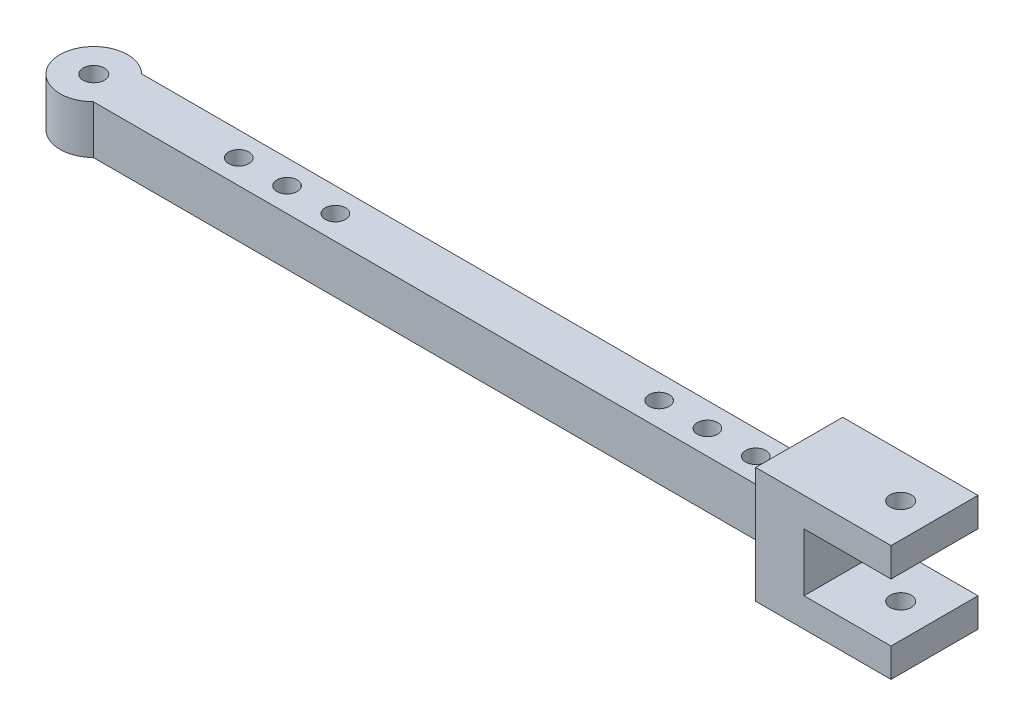
ISO-10303-21;
HEADER;
FILE_DESCRIPTION(('STEP AP214'),'2;1');
FILE_NAME('part.step','',(''),(''),'','','');
FILE_SCHEMA(('AUTOMOTIVE_DESIGN { 1 0 10303 214 1 1 1 1 }'));
ENDSEC;
DATA;
#1=APPLICATION_CONTEXT('core data for automotive mechanical design processes');
#2=APPLICATION_PROTOCOL_DEFINITION('international standard','automotive_design',2000,#1);
#3=PRODUCT_CONTEXT('',#1,'mechanical');
#4=PRODUCT('Part','Part','',(#3));
#5=PRODUCT_RELATED_PRODUCT_CATEGORY('part','',(#4));
#6=PRODUCT_DEFINITION_FORMATION('','',#4);
#7=PRODUCT_DEFINITION_CONTEXT('part definition',#1,'design');
#8=PRODUCT_DEFINITION('design','',#6,#7);
#9=PRODUCT_DEFINITION_SHAPE('','',#8);
#10=(LENGTH_UNIT() NAMED_UNIT(*) SI_UNIT(.MILLI.,.METRE.));
#11=(NAMED_UNIT(*) PLANE_ANGLE_UNIT() SI_UNIT($,.RADIAN.));
#12=(NAMED_UNIT(*) SI_UNIT($,.STERADIAN.) SOLID_ANGLE_UNIT());
#13=UNCERTAINTY_MEASURE_WITH_UNIT(LENGTH_MEASURE(1.E-05),#10,'distance_accuracy_value','');
#14=(GEOMETRIC_REPRESENTATION_CONTEXT(3) GLOBAL_UNCERTAINTY_ASSIGNED_CONTEXT((#13)) GLOBAL_UNIT_ASSIGNED_CONTEXT((#10,
#11,#12)) REPRESENTATION_CONTEXT('',''));
#15=CARTESIAN_POINT('',(0.,0.,0.));
#16=DIRECTION('',(0.,0.,1.));
#17=DIRECTION('',(1.,0.,0.));
#18=AXIS2_PLACEMENT_3D('',#15,#16,#17);
#19=CARTESIAN_POINT('',(47.,-3.5,-4.5));
#20=DIRECTION('',(1.,0.,0.));
#21=DIRECTION('',(0.,0.,-1.));
#22=AXIS2_PLACEMENT_3D('',#19,#20,#21);
#23=PLANE('',#22);
#24=DIRECTION('',(0.,1.,0.));
#25=VECTOR('',#24,1.);
#26=CARTESIAN_POINT('',(47.,-3.5,4.5));
#27=LINE('',#26,#25);
#28=CARTESIAN_POINT('',(47.,5.5,4.5));
#29=VERTEX_POINT('',#28);
#30=CARTESIAN_POINT('',(47.,8.5,4.5));
#31=VERTEX_POINT('',#30);
#32=EDGE_CURVE('E167',#29,#31,#27,.T.);
#33=ORIENTED_EDGE('',*,*,#32,.F.);
#34=DIRECTION('',(0.,0.,-1.));
#35=VECTOR('',#34,1.);
#36=CARTESIAN_POINT('',(47.,5.5,-4.5));
#37=LINE('',#36,#35);
#38=CARTESIAN_POINT('',(47.,5.5,-4.5));
#39=VERTEX_POINT('',#38);
#40=EDGE_CURVE('E208',#29,#39,#37,.T.);
#41=ORIENTED_EDGE('',*,*,#40,.T.);
#42=DIRECTION('',(0.,1.,0.));
#43=VECTOR('',#42,1.);
#44=CARTESIAN_POINT('',(47.,-3.5,-4.5));
#45=LINE('',#44,#43);
#46=CARTESIAN_POINT('',(47.,8.5,-4.5));
#47=VERTEX_POINT('',#46);
#48=EDGE_CURVE('E163',#39,#47,#45,.T.);
#49=ORIENTED_EDGE('',*,*,#48,.T.);
#50=DIRECTION('',(0.,0.,-1.));
#51=VECTOR('',#50,1.);
#52=CARTESIAN_POINT('',(47.,8.5,-4.5));
#53=LINE('',#52,#51);
#54=EDGE_CURVE('E180',#31,#47,#53,.T.);
#55=ORIENTED_EDGE('',*,*,#54,.F.);
#56=EDGE_LOOP('',(#33,#41,#49,#55));
#57=FACE_BOUND('',#56,.T.);
#58=ADVANCED_FACE('F35',(#57),#23,.T.);
#59=DIRECTION('',(0.,0.,-1.));
#60=VECTOR('',#59,1.);
#61=CARTESIAN_POINT('',(47.,-0.5,-4.5));
#62=LINE('',#61,#60);
#63=CARTESIAN_POINT('',(47.,-0.5,4.5));
#64=VERTEX_POINT('',#63);
#65=CARTESIAN_POINT('',(47.,-0.5,-4.5));
#66=VERTEX_POINT('',#65);
#67=EDGE_CURVE('E203',#64,#66,#62,.T.);
#68=ORIENTED_EDGE('',*,*,#67,.F.);
#69=CARTESIAN_POINT('',(47.,-3.5,4.5));
#70=VERTEX_POINT('',#69);
#71=EDGE_CURVE('E158',#70,#64,#27,.T.);
#72=ORIENTED_EDGE('',*,*,#71,.F.);
#73=DIRECTION('',(0.,0.,-1.));
#74=VECTOR('',#73,1.);
#75=CARTESIAN_POINT('',(47.,-3.5,-4.5));
#76=LINE('',#75,#74);
#77=CARTESIAN_POINT('',(47.,-3.5,-4.5));
#78=VERTEX_POINT('',#77);
#79=EDGE_CURVE('E173',#70,#78,#76,.T.);
#80=ORIENTED_EDGE('',*,*,#79,.T.);
#81=EDGE_CURVE('E159',#78,#66,#45,.T.);
#82=ORIENTED_EDGE('',*,*,#81,.T.);
#83=EDGE_LOOP('',(#68,#72,#80,#82));
#84=FACE_BOUND('',#83,.T.);
#85=ADVANCED_FACE('F335',(#84),#23,.T.);
#86=CARTESIAN_POINT('',(33.,-3.5,4.5));
#87=DIRECTION('',(0.,0.,1.));
#88=DIRECTION('',(1.,0.,0.));
#89=AXIS2_PLACEMENT_3D('',#86,#87,#88);
#90=PLANE('',#89);
#91=DIRECTION('',(1.,0.,0.));
#92=VECTOR('',#91,1.);
#93=CARTESIAN_POINT('',(47.,-0.5,4.5));
#94=LINE('',#93,#92);
#95=CARTESIAN_POINT('',(38.,-0.5,4.5));
#96=VERTEX_POINT('',#95);
#97=EDGE_CURVE('E197',#96,#64,#94,.T.);
#98=ORIENTED_EDGE('',*,*,#97,.F.);
#99=DIRECTION('',(0.,1.,0.));
#100=VECTOR('',#99,1.);
#101=CARTESIAN_POINT('',(38.,-0.5,4.5));
#102=LINE('',#101,#100);
#103=CARTESIAN_POINT('',(38.,5.5,4.5));
#104=VERTEX_POINT('',#103);
#105=EDGE_CURVE('E183',#96,#104,#102,.T.);
#106=ORIENTED_EDGE('',*,*,#105,.T.);
#107=DIRECTION('',(1.,0.,0.));
#108=VECTOR('',#107,1.);
#109=CARTESIAN_POINT('',(47.,5.5,4.5));
#110=LINE('',#109,#108);
#111=EDGE_CURVE('E200',#104,#29,#110,.T.);
#112=ORIENTED_EDGE('',*,*,#111,.T.);
#113=ORIENTED_EDGE('',*,*,#32,.T.);
#114=DIRECTION('',(1.,0.,0.));
#115=VECTOR('',#114,1.);
#116=CARTESIAN_POINT('',(33.,8.5,4.5));
#117=LINE('',#116,#115);
#118=CARTESIAN_POINT('',(33.,8.5,4.5));
#119=VERTEX_POINT('',#118);
#120=EDGE_CURVE('E170',#119,#31,#117,.T.);
#121=ORIENTED_EDGE('',*,*,#120,.F.);
#122=DIRECTION('',(0.,1.,0.));
#123=VECTOR('',#122,1.);
#124=CARTESIAN_POINT('',(33.,-3.5,4.5));
#125=LINE('',#124,#123);
#126=CARTESIAN_POINT('',(33.,-3.5,4.5));
#127=VERTEX_POINT('',#126);
#128=EDGE_CURVE('E165',#127,#119,#125,.T.);
#129=ORIENTED_EDGE('',*,*,#128,.F.);
#130=DIRECTION('',(1.,0.,0.));
#131=VECTOR('',#130,1.);
#132=CARTESIAN_POINT('',(33.,-3.5,4.5));
#133=LINE('',#132,#131);
#134=EDGE_CURVE('E184',#127,#70,#133,.T.);
#135=ORIENTED_EDGE('',*,*,#134,.T.);
#136=ORIENTED_EDGE('',*,*,#71,.T.);
#137=EDGE_LOOP('',(#98,#106,#112,#113,#121,#129,#135,#136));
#138=FACE_BOUND('',#137,.T.);
#139=ADVANCED_FACE('F316',(#138),#90,.T.);
#140=CARTESIAN_POINT('',(33.,-3.5,-4.5));
#141=DIRECTION('',(-1.,0.,0.));
#142=DIRECTION('',(0.,0.,1.));
#143=AXIS2_PLACEMENT_3D('',#140,#141,#142);
#144=PLANE('',#143);
#145=DIRECTION('',(0.,-1.,0.));
#146=VECTOR('',#145,1.);
#147=CARTESIAN_POINT('',(33.,5.,-2.5));
#148=LINE('',#147,#146);
#149=CARTESIAN_POINT('',(33.,5.,-2.5));
#150=VERTEX_POINT('',#149);
#151=CARTESIAN_POINT('',(33.,0.,-2.5));
#152=VERTEX_POINT('',#151);
#153=EDGE_CURVE('E153',#150,#152,#148,.T.);
#154=ORIENTED_EDGE('',*,*,#153,.F.);
#155=DIRECTION('',(0.,0.,1.));
#156=VECTOR('',#155,1.);
#157=CARTESIAN_POINT('',(33.,5.,0.));
#158=LINE('',#157,#156);
#159=CARTESIAN_POINT('',(33.,5.,2.5));
#160=VERTEX_POINT('',#159);
#161=EDGE_CURVE('E147',#150,#160,#158,.T.);
#162=ORIENTED_EDGE('',*,*,#161,.T.);
#163=DIRECTION('',(0.,1.,0.));
#164=VECTOR('',#163,1.);
#165=CARTESIAN_POINT('',(33.,5.,2.5));
#166=LINE('',#165,#164);
#167=CARTESIAN_POINT('',(33.,0.,2.5));
#168=VERTEX_POINT('',#167);
#169=EDGE_CURVE('E156',#168,#160,#166,.T.);
#170=ORIENTED_EDGE('',*,*,#169,.F.);
#171=DIRECTION('',(0.,0.,1.));
#172=VECTOR('',#171,1.);
#173=CARTESIAN_POINT('',(33.,0.,0.));
#174=LINE('',#173,#172);
#175=EDGE_CURVE('E11',#152,#168,#174,.T.);
#176=ORIENTED_EDGE('',*,*,#175,.F.);
#177=EDGE_LOOP('',(#154,#162,#170,#176));
#178=FACE_BOUND('',#177,.T.);
#179=DIRECTION('',(0.,0.,1.));
#180=VECTOR('',#179,1.);
#181=CARTESIAN_POINT('',(33.,8.5,-4.5));
#182=LINE('',#181,#180);
#183=CARTESIAN_POINT('',(33.,8.5,-4.5));
#184=VERTEX_POINT('',#183);
#185=EDGE_CURVE('E174',#184,#119,#182,.T.);
#186=ORIENTED_EDGE('',*,*,#185,.F.);
#187=DIRECTION('',(0.,1.,0.));
#188=VECTOR('',#187,1.);
#189=CARTESIAN_POINT('',(33.,-3.5,-4.5));
#190=LINE('',#189,#188);
#191=CARTESIAN_POINT('',(33.,-3.5,-4.5));
#192=VERTEX_POINT('',#191);
#193=EDGE_CURVE('E162',#192,#184,#190,.T.);
#194=ORIENTED_EDGE('',*,*,#193,.F.);
#195=DIRECTION('',(0.,0.,1.));
#196=VECTOR('',#195,1.);
#197=CARTESIAN_POINT('',(33.,-3.5,-4.5));
#198=LINE('',#197,#196);
#199=EDGE_CURVE('E187',#192,#127,#198,.T.);
#200=ORIENTED_EDGE('',*,*,#199,.T.);
#201=ORIENTED_EDGE('',*,*,#128,.T.);
#202=EDGE_LOOP('',(#186,#194,#200,#201));
#203=FACE_BOUND('',#202,.T.);
#204=ADVANCED_FACE('F312',(#178,#203),#144,.T.);
#205=CARTESIAN_POINT('',(33.,-3.5,-4.5));
#206=DIRECTION('',(0.,0.,-1.));
#207=DIRECTION('',(-1.,0.,0.));
#208=AXIS2_PLACEMENT_3D('',#205,#206,#207);
#209=PLANE('',#208);
#210=DIRECTION('',(-1.,0.,0.));
#211=VECTOR('',#210,1.);
#212=CARTESIAN_POINT('',(47.,-0.5,-4.5));
#213=LINE('',#212,#211);
#214=CARTESIAN_POINT('',(38.,-0.5,-4.5));
#215=VERTEX_POINT('',#214);
#216=EDGE_CURVE('E216',#66,#215,#213,.T.);
#217=ORIENTED_EDGE('',*,*,#216,.F.);
#218=ORIENTED_EDGE('',*,*,#81,.F.);
#219=DIRECTION('',(-1.,0.,0.));
#220=VECTOR('',#219,1.);
#221=CARTESIAN_POINT('',(33.,-3.5,-4.5));
#222=LINE('',#221,#220);
#223=EDGE_CURVE('E190',#78,#192,#222,.T.);
#224=ORIENTED_EDGE('',*,*,#223,.T.);
#225=ORIENTED_EDGE('',*,*,#193,.T.);
#226=DIRECTION('',(-1.,0.,0.));
#227=VECTOR('',#226,1.);
#228=CARTESIAN_POINT('',(33.,8.5,-4.5));
#229=LINE('',#228,#227);
#230=EDGE_CURVE('E177',#47,#184,#229,.T.);
#231=ORIENTED_EDGE('',*,*,#230,.F.);
#232=ORIENTED_EDGE('',*,*,#48,.F.);
#233=DIRECTION('',(-1.,0.,0.));
#234=VECTOR('',#233,1.);
#235=CARTESIAN_POINT('',(47.,5.5,-4.5));
#236=LINE('',#235,#234);
#237=CARTESIAN_POINT('',(38.,5.5,-4.5));
#238=VERTEX_POINT('',#237);
#239=EDGE_CURVE('E205',#39,#238,#236,.T.);
#240=ORIENTED_EDGE('',*,*,#239,.T.);
#241=DIRECTION('',(0.,1.,0.));
#242=VECTOR('',#241,1.);
#243=CARTESIAN_POINT('',(38.,-0.5,-4.5));
#244=LINE('',#243,#242);
#245=EDGE_CURVE('E195',#215,#238,#244,.T.);
#246=ORIENTED_EDGE('',*,*,#245,.F.);
#247=EDGE_LOOP('',(#217,#218,#224,#225,#231,#232,#240,#246));
#248=FACE_BOUND('',#247,.T.);
#249=ADVANCED_FACE('F315',(#248),#209,.T.);
#250=CARTESIAN_POINT('',(0.,-3.5,0.));
#251=DIRECTION('',(0.,1.,0.));
#252=DIRECTION('',(0.,0.,1.));
#253=AXIS2_PLACEMENT_3D('',#250,#251,#252);
#254=PLANE('',#253);
#255=CARTESIAN_POINT('',(43.5,-3.5,0.));
#256=DIRECTION('',(0.,1.,0.));
#257=DIRECTION('',(0.,0.,1.));
#258=AXIS2_PLACEMENT_3D('',#255,#256,#257);
#259=CIRCLE('',#258,1.1);
#260=CARTESIAN_POINT('',(43.5,-3.5,1.1));
#261=VERTEX_POINT('',#260);
#262=EDGE_CURVE('E225',#261,#261,#259,.T.);
#263=ORIENTED_EDGE('',*,*,#262,.T.);
#264=EDGE_LOOP('',(#263));
#265=FACE_BOUND('',#264,.T.);
#266=ORIENTED_EDGE('',*,*,#79,.F.);
#267=ORIENTED_EDGE('',*,*,#134,.F.);
#268=ORIENTED_EDGE('',*,*,#199,.F.);
#269=ORIENTED_EDGE('',*,*,#223,.F.);
#270=EDGE_LOOP('',(#266,#267,#268,#269));
#271=FACE_BOUND('',#270,.T.);
#272=ADVANCED_FACE('F331',(#265,#271),#254,.F.);
#273=CARTESIAN_POINT('',(0.,8.5,0.));
#274=DIRECTION('',(0.,1.,0.));
#275=DIRECTION('',(0.,0.,1.));
#276=AXIS2_PLACEMENT_3D('',#273,#274,#275);
#277=PLANE('',#276);
#278=CARTESIAN_POINT('',(43.5,8.5,0.));
#279=DIRECTION('',(0.,1.,0.));
#280=DIRECTION('',(0.,0.,1.));
#281=AXIS2_PLACEMENT_3D('',#278,#279,#280);
#282=CIRCLE('',#281,1.1);
#283=CARTESIAN_POINT('',(43.5,8.5,1.1));
#284=VERTEX_POINT('',#283);
#285=EDGE_CURVE('E222',#284,#284,#282,.T.);
#286=ORIENTED_EDGE('',*,*,#285,.F.);
#287=EDGE_LOOP('',(#286));
#288=FACE_BOUND('',#287,.T.);
#289=ORIENTED_EDGE('',*,*,#54,.T.);
#290=ORIENTED_EDGE('',*,*,#230,.T.);
#291=ORIENTED_EDGE('',*,*,#185,.T.);
#292=ORIENTED_EDGE('',*,*,#120,.T.);
#293=EDGE_LOOP('',(#289,#290,#291,#292));
#294=FACE_BOUND('',#293,.T.);
#295=ADVANCED_FACE('F323',(#288,#294),#277,.T.);
#296=CARTESIAN_POINT('',(-40.,5.,-2.5));
#297=DIRECTION('',(0.,0.,1.));
#298=DIRECTION('',(1.,0.,0.));
#299=AXIS2_PLACEMENT_3D('',#296,#297,#298);
#300=PLANE('',#299);
#301=DIRECTION('',(-1.,0.,0.));
#302=VECTOR('',#301,1.);
#303=CARTESIAN_POINT('',(-40.,0.,-2.5));
#304=LINE('',#303,#302);
#305=CARTESIAN_POINT('',(-37.5505102572168,0.,-2.5));
#306=VERTEX_POINT('',#305);
#307=EDGE_CURVE('E144',#152,#306,#304,.T.);
#308=ORIENTED_EDGE('',*,*,#307,.T.);
#309=DIRECTION('',(0.,1.,0.));
#310=VECTOR('',#309,1.);
#311=CARTESIAN_POINT('',(-37.5505102572168,0.,-2.5));
#312=LINE('',#311,#310);
#313=CARTESIAN_POINT('',(-37.5505102572168,5.,-2.5));
#314=VERTEX_POINT('',#313);
#315=EDGE_CURVE('E130',#306,#314,#312,.T.);
#316=ORIENTED_EDGE('',*,*,#315,.T.);
#317=DIRECTION('',(-1.,0.,0.));
#318=VECTOR('',#317,1.);
#319=CARTESIAN_POINT('',(-40.,5.,-2.5));
#320=LINE('',#319,#318);
#321=EDGE_CURVE('E143',#150,#314,#320,.T.);
#322=ORIENTED_EDGE('',*,*,#321,.F.);
#323=ORIENTED_EDGE('',*,*,#153,.T.);
#324=EDGE_LOOP('',(#308,#316,#322,#323));
#325=FACE_BOUND('',#324,.T.);
#326=ADVANCED_FACE('F37',(#325),#300,.F.);
#327=CARTESIAN_POINT('',(-40.,5.,2.5));
#328=DIRECTION('',(0.,0.,-1.));
#329=DIRECTION('',(-1.,0.,0.));
#330=AXIS2_PLACEMENT_3D('',#327,#328,#329);
#331=PLANE('',#330);
#332=DIRECTION('',(1.,0.,0.));
#333=VECTOR('',#332,1.);
#334=CARTESIAN_POINT('',(-40.,5.,2.5));
#335=LINE('',#334,#333);
#336=CARTESIAN_POINT('',(-37.5505102572168,5.,2.5));
#337=VERTEX_POINT('',#336);
#338=EDGE_CURVE('E44',#337,#160,#335,.T.);
#339=ORIENTED_EDGE('',*,*,#338,.F.);
#340=DIRECTION('',(0.,1.,0.));
#341=VECTOR('',#340,1.);
#342=CARTESIAN_POINT('',(-37.5505102572168,0.,2.5));
#343=LINE('',#342,#341);
#344=CARTESIAN_POINT('',(-37.5505102572168,0.,2.5));
#345=VERTEX_POINT('',#344);
#346=EDGE_CURVE('E127',#337,#345,#343,.F.);
#347=ORIENTED_EDGE('',*,*,#346,.T.);
#348=DIRECTION('',(1.,0.,0.));
#349=VECTOR('',#348,1.);
#350=CARTESIAN_POINT('',(-40.,0.,2.5));
#351=LINE('',#350,#349);
#352=EDGE_CURVE('E139',#345,#168,#351,.T.);
#353=ORIENTED_EDGE('',*,*,#352,.T.);
#354=ORIENTED_EDGE('',*,*,#169,.T.);
#355=EDGE_LOOP('',(#339,#347,#353,#354));
#356=FACE_BOUND('',#355,.T.);
#357=ADVANCED_FACE('F137',(#356),#331,.F.);
#358=CARTESIAN_POINT('',(0.,5.,0.));
#359=DIRECTION('',(0.,1.,0.));
#360=DIRECTION('',(0.,0.,1.));
#361=AXIS2_PLACEMENT_3D('',#358,#359,#360);
#362=PLANE('',#361);
#363=CARTESIAN_POINT('',(28.5,5.,0.));
#364=DIRECTION('',(0.,-1.,0.));
#365=DIRECTION('',(0.,0.,-1.));
#366=AXIS2_PLACEMENT_3D('',#363,#364,#365);
#367=CIRCLE('',#366,1.05);
#368=CARTESIAN_POINT('',(28.5,5.,-1.05));
#369=VERTEX_POINT('',#368);
#370=EDGE_CURVE('E264',#369,#369,#367,.T.);
#371=ORIENTED_EDGE('',*,*,#370,.T.);
#372=EDGE_LOOP('',(#371));
#373=FACE_BOUND('',#372,.T.);
#374=CARTESIAN_POINT('',(18.5,5.,0.));
#375=DIRECTION('',(0.,-1.,0.));
#376=DIRECTION('',(0.,0.,-1.));
#377=AXIS2_PLACEMENT_3D('',#374,#375,#376);
#378=CIRCLE('',#377,1.05);
#379=CARTESIAN_POINT('',(18.5,5.,-1.05));
#380=VERTEX_POINT('',#379);
#381=EDGE_CURVE('E258',#380,#380,#378,.T.);
#382=ORIENTED_EDGE('',*,*,#381,.T.);
#383=EDGE_LOOP('',(#382));
#384=FACE_BOUND('',#383,.T.);
#385=CARTESIAN_POINT('',(-15.,5.,0.));
#386=DIRECTION('',(0.,-1.,0.));
#387=DIRECTION('',(0.,0.,-1.));
#388=AXIS2_PLACEMENT_3D('',#385,#386,#387);
#389=CIRCLE('',#388,1.05);
#390=CARTESIAN_POINT('',(-15.,5.,-1.05));
#391=VERTEX_POINT('',#390);
#392=EDGE_CURVE('E252',#391,#391,#389,.T.);
#393=ORIENTED_EDGE('',*,*,#392,.T.);
#394=EDGE_LOOP('',(#393));
#395=FACE_BOUND('',#394,.T.);
#396=CARTESIAN_POINT('',(-25.,5.,0.));
#397=DIRECTION('',(0.,-1.,0.));
#398=DIRECTION('',(0.,0.,-1.));
#399=AXIS2_PLACEMENT_3D('',#396,#397,#398);
#400=CIRCLE('',#399,1.05);
#401=CARTESIAN_POINT('',(-25.,5.,-1.05));
#402=VERTEX_POINT('',#401);
#403=EDGE_CURVE('E246',#402,#402,#400,.T.);
#404=ORIENTED_EDGE('',*,*,#403,.T.);
#405=EDGE_LOOP('',(#404));
#406=FACE_BOUND('',#405,.T.);
#407=CARTESIAN_POINT('',(23.5,5.,0.));
#408=DIRECTION('',(0.,-1.,0.));
#409=DIRECTION('',(0.,0.,-1.));
#410=AXIS2_PLACEMENT_3D('',#407,#408,#409);
#411=CIRCLE('',#410,1.05);
#412=CARTESIAN_POINT('',(23.5,5.,-1.05));
#413=VERTEX_POINT('',#412);
#414=EDGE_CURVE('E240',#413,#413,#411,.T.);
#415=ORIENTED_EDGE('',*,*,#414,.T.);
#416=EDGE_LOOP('',(#415));
#417=FACE_BOUND('',#416,.T.);
#418=CARTESIAN_POINT('',(-20.,5.,0.));
#419=DIRECTION('',(0.,-1.,0.));
#420=DIRECTION('',(0.,0.,-1.));
#421=AXIS2_PLACEMENT_3D('',#418,#419,#420);
#422=CIRCLE('',#421,1.05);
#423=CARTESIAN_POINT('',(-20.,5.,-1.05));
#424=VERTEX_POINT('',#423);
#425=EDGE_CURVE('E234',#424,#424,#422,.T.);
#426=ORIENTED_EDGE('',*,*,#425,.T.);
#427=EDGE_LOOP('',(#426));
#428=FACE_BOUND('',#427,.T.);
#429=CARTESIAN_POINT('',(-40.,5.,0.));
#430=DIRECTION('',(0.,1.,0.));
#431=DIRECTION('',(0.,0.,1.));
#432=AXIS2_PLACEMENT_3D('',#429,#430,#431);
#433=CIRCLE('',#432,1.1);
#434=CARTESIAN_POINT('',(-40.,5.,1.1));
#435=VERTEX_POINT('',#434);
#436=EDGE_CURVE('E231',#435,#435,#433,.T.);
#437=ORIENTED_EDGE('',*,*,#436,.F.);
#438=EDGE_LOOP('',(#437));
#439=FACE_BOUND('',#438,.T.);
#440=ORIENTED_EDGE('',*,*,#321,.T.);
#441=CARTESIAN_POINT('',(-40.,5.,0.));
#442=DIRECTION('',(0.,1.,0.));
#443=DIRECTION('',(0.,0.,1.));
#444=AXIS2_PLACEMENT_3D('',#441,#442,#443);
#445=CIRCLE('',#444,3.5);
#446=EDGE_CURVE('E51',#314,#337,#445,.T.);
#447=ORIENTED_EDGE('',*,*,#446,.T.);
#448=ORIENTED_EDGE('',*,*,#338,.T.);
#449=ORIENTED_EDGE('',*,*,#161,.F.);
#450=EDGE_LOOP('',(#440,#447,#448,#449));
#451=FACE_BOUND('',#450,.T.);
#452=ADVANCED_FACE('F273',(#373,#384,#395,#406,#417,#428,#439,#451),#362,.T.);
#453=CARTESIAN_POINT('',(0.,0.,0.));
#454=DIRECTION('',(0.,1.,0.));
#455=DIRECTION('',(0.,0.,1.));
#456=AXIS2_PLACEMENT_3D('',#453,#454,#455);
#457=PLANE('',#456);
#458=CARTESIAN_POINT('',(28.5,0.,0.));
#459=DIRECTION('',(0.,-1.,0.));
#460=DIRECTION('',(0.,0.,-1.));
#461=AXIS2_PLACEMENT_3D('',#458,#459,#460);
#462=CIRCLE('',#461,1.05);
#463=CARTESIAN_POINT('',(28.5,0.,-1.05));
#464=VERTEX_POINT('',#463);
#465=EDGE_CURVE('E267',#464,#464,#462,.T.);
#466=ORIENTED_EDGE('',*,*,#465,.F.);
#467=EDGE_LOOP('',(#466));
#468=FACE_BOUND('',#467,.T.);
#469=CARTESIAN_POINT('',(18.5,0.,0.));
#470=DIRECTION('',(0.,-1.,0.));
#471=DIRECTION('',(0.,0.,-1.));
#472=AXIS2_PLACEMENT_3D('',#469,#470,#471);
#473=CIRCLE('',#472,1.05);
#474=CARTESIAN_POINT('',(18.5,0.,-1.05));
#475=VERTEX_POINT('',#474);
#476=EDGE_CURVE('E261',#475,#475,#473,.T.);
#477=ORIENTED_EDGE('',*,*,#476,.F.);
#478=EDGE_LOOP('',(#477));
#479=FACE_BOUND('',#478,.T.);
#480=CARTESIAN_POINT('',(-15.,0.,0.));
#481=DIRECTION('',(0.,-1.,0.));
#482=DIRECTION('',(0.,0.,-1.));
#483=AXIS2_PLACEMENT_3D('',#480,#481,#482);
#484=CIRCLE('',#483,1.05);
#485=CARTESIAN_POINT('',(-15.,0.,-1.05));
#486=VERTEX_POINT('',#485);
#487=EDGE_CURVE('E255',#486,#486,#484,.T.);
#488=ORIENTED_EDGE('',*,*,#487,.F.);
#489=EDGE_LOOP('',(#488));
#490=FACE_BOUND('',#489,.T.);
#491=CARTESIAN_POINT('',(-25.,0.,0.));
#492=DIRECTION('',(0.,-1.,0.));
#493=DIRECTION('',(0.,0.,-1.));
#494=AXIS2_PLACEMENT_3D('',#491,#492,#493);
#495=CIRCLE('',#494,1.05);
#496=CARTESIAN_POINT('',(-25.,0.,-1.05));
#497=VERTEX_POINT('',#496);
#498=EDGE_CURVE('E249',#497,#497,#495,.T.);
#499=ORIENTED_EDGE('',*,*,#498,.F.);
#500=EDGE_LOOP('',(#499));
#501=FACE_BOUND('',#500,.T.);
#502=CARTESIAN_POINT('',(23.5,0.,0.));
#503=DIRECTION('',(0.,-1.,0.));
#504=DIRECTION('',(0.,0.,-1.));
#505=AXIS2_PLACEMENT_3D('',#502,#503,#504);
#506=CIRCLE('',#505,1.05);
#507=CARTESIAN_POINT('',(23.5,0.,-1.05));
#508=VERTEX_POINT('',#507);
#509=EDGE_CURVE('E243',#508,#508,#506,.T.);
#510=ORIENTED_EDGE('',*,*,#509,.F.);
#511=EDGE_LOOP('',(#510));
#512=FACE_BOUND('',#511,.T.);
#513=CARTESIAN_POINT('',(-20.,0.,0.));
#514=DIRECTION('',(0.,-1.,0.));
#515=DIRECTION('',(0.,0.,-1.));
#516=AXIS2_PLACEMENT_3D('',#513,#514,#515);
#517=CIRCLE('',#516,1.05);
#518=CARTESIAN_POINT('',(-20.,0.,-1.05));
#519=VERTEX_POINT('',#518);
#520=EDGE_CURVE('E237',#519,#519,#517,.T.);
#521=ORIENTED_EDGE('',*,*,#520,.F.);
#522=EDGE_LOOP('',(#521));
#523=FACE_BOUND('',#522,.T.);
#524=CARTESIAN_POINT('',(-40.,0.,0.));
#525=DIRECTION('',(0.,1.,0.));
#526=DIRECTION('',(0.,0.,1.));
#527=AXIS2_PLACEMENT_3D('',#524,#525,#526);
#528=CIRCLE('',#527,1.1);
#529=CARTESIAN_POINT('',(-40.,0.,1.1));
#530=VERTEX_POINT('',#529);
#531=EDGE_CURVE('E229',#530,#530,#528,.T.);
#532=ORIENTED_EDGE('',*,*,#531,.T.);
#533=EDGE_LOOP('',(#532));
#534=FACE_BOUND('',#533,.T.);
#535=ORIENTED_EDGE('',*,*,#352,.F.);
#536=CARTESIAN_POINT('',(-40.,0.,0.));
#537=DIRECTION('',(0.,1.,0.));
#538=DIRECTION('',(0.,0.,1.));
#539=AXIS2_PLACEMENT_3D('',#536,#537,#538);
#540=CIRCLE('',#539,3.5);
#541=EDGE_CURVE('E124',#306,#345,#540,.T.);
#542=ORIENTED_EDGE('',*,*,#541,.F.);
#543=ORIENTED_EDGE('',*,*,#307,.F.);
#544=ORIENTED_EDGE('',*,*,#175,.T.);
#545=EDGE_LOOP('',(#535,#542,#543,#544));
#546=FACE_BOUND('',#545,.T.);
#547=ADVANCED_FACE('F142',(#468,#479,#490,#501,#512,#523,#534,#546),#457,.F.);
#548=CARTESIAN_POINT('',(38.,-0.5,-4.5));
#549=DIRECTION('',(-1.,0.,0.));
#550=DIRECTION('',(0.,0.,1.));
#551=AXIS2_PLACEMENT_3D('',#548,#549,#550);
#552=PLANE('',#551);
#553=DIRECTION('',(0.,0.,1.));
#554=VECTOR('',#553,1.);
#555=CARTESIAN_POINT('',(38.,5.5,-4.5));
#556=LINE('',#555,#554);
#557=EDGE_CURVE('E59',#238,#104,#556,.T.);
#558=ORIENTED_EDGE('',*,*,#557,.T.);
#559=ORIENTED_EDGE('',*,*,#105,.F.);
#560=DIRECTION('',(0.,0.,1.));
#561=VECTOR('',#560,1.);
#562=CARTESIAN_POINT('',(38.,-0.5,-4.5));
#563=LINE('',#562,#561);
#564=EDGE_CURVE('E213',#215,#96,#563,.T.);
#565=ORIENTED_EDGE('',*,*,#564,.F.);
#566=ORIENTED_EDGE('',*,*,#245,.T.);
#567=EDGE_LOOP('',(#558,#559,#565,#566));
#568=FACE_BOUND('',#567,.T.);
#569=ADVANCED_FACE('F285',(#568),#552,.F.);
#570=CARTESIAN_POINT('',(0.,-0.5,0.));
#571=DIRECTION('',(0.,-1.,0.));
#572=DIRECTION('',(0.,0.,-1.));
#573=AXIS2_PLACEMENT_3D('',#570,#571,#572);
#574=PLANE('',#573);
#575=CARTESIAN_POINT('',(43.5,-0.5,0.));
#576=DIRECTION('',(0.,-1.,0.));
#577=DIRECTION('',(0.,0.,-1.));
#578=AXIS2_PLACEMENT_3D('',#575,#576,#577);
#579=CIRCLE('',#578,1.1);
#580=CARTESIAN_POINT('',(43.5,-0.5,-1.1));
#581=VERTEX_POINT('',#580);
#582=EDGE_CURVE('E211',#581,#581,#579,.T.);
#583=ORIENTED_EDGE('',*,*,#582,.T.);
#584=EDGE_LOOP('',(#583));
#585=FACE_BOUND('',#584,.T.);
#586=ORIENTED_EDGE('',*,*,#67,.T.);
#587=ORIENTED_EDGE('',*,*,#216,.T.);
#588=ORIENTED_EDGE('',*,*,#564,.T.);
#589=ORIENTED_EDGE('',*,*,#97,.T.);
#590=EDGE_LOOP('',(#586,#587,#588,#589));
#591=FACE_BOUND('',#590,.T.);
#592=ADVANCED_FACE('F344',(#585,#591),#574,.F.);
#593=CARTESIAN_POINT('',(0.,5.5,0.));
#594=DIRECTION('',(0.,-1.,0.));
#595=DIRECTION('',(0.,0.,-1.));
#596=AXIS2_PLACEMENT_3D('',#593,#594,#595);
#597=PLANE('',#596);
#598=CARTESIAN_POINT('',(43.5,5.5,0.));
#599=DIRECTION('',(0.,-1.,0.));
#600=DIRECTION('',(0.,0.,-1.));
#601=AXIS2_PLACEMENT_3D('',#598,#599,#600);
#602=CIRCLE('',#601,1.1);
#603=CARTESIAN_POINT('',(43.5,5.5,-1.1));
#604=VERTEX_POINT('',#603);
#605=EDGE_CURVE('E39',#604,#604,#602,.T.);
#606=ORIENTED_EDGE('',*,*,#605,.F.);
#607=EDGE_LOOP('',(#606));
#608=FACE_BOUND('',#607,.T.);
#609=ORIENTED_EDGE('',*,*,#40,.F.);
#610=ORIENTED_EDGE('',*,*,#111,.F.);
#611=ORIENTED_EDGE('',*,*,#557,.F.);
#612=ORIENTED_EDGE('',*,*,#239,.F.);
#613=EDGE_LOOP('',(#609,#610,#611,#612));
#614=FACE_BOUND('',#613,.T.);
#615=ADVANCED_FACE('F340',(#608,#614),#597,.T.);
#616=CARTESIAN_POINT('',(43.5,-3.5,0.));
#617=DIRECTION('',(0.,1.,0.));
#618=DIRECTION('',(0.,0.,1.));
#619=AXIS2_PLACEMENT_3D('',#616,#617,#618);
#620=CYLINDRICAL_SURFACE('',#619,1.1);
#621=ORIENTED_EDGE('',*,*,#605,.T.);
#622=EDGE_LOOP('',(#621));
#623=FACE_BOUND('',#622,.T.);
#624=ORIENTED_EDGE('',*,*,#285,.T.);
#625=EDGE_LOOP('',(#624));
#626=FACE_BOUND('',#625,.T.);
#627=ADVANCED_FACE('F352',(#623,#626),#620,.F.);
#628=ORIENTED_EDGE('',*,*,#262,.F.);
#629=EDGE_LOOP('',(#628));
#630=FACE_BOUND('',#629,.T.);
#631=ORIENTED_EDGE('',*,*,#582,.F.);
#632=EDGE_LOOP('',(#631));
#633=FACE_BOUND('',#632,.T.);
#634=ADVANCED_FACE('F424',(#630,#633),#620,.F.);
#635=CARTESIAN_POINT('',(-40.,0.,0.));
#636=DIRECTION('',(0.,1.,0.));
#637=DIRECTION('',(0.,0.,1.));
#638=AXIS2_PLACEMENT_3D('',#635,#636,#637);
#639=CYLINDRICAL_SURFACE('',#638,3.5);
#640=ORIENTED_EDGE('',*,*,#315,.F.);
#641=ORIENTED_EDGE('',*,*,#541,.T.);
#642=ORIENTED_EDGE('',*,*,#346,.F.);
#643=ORIENTED_EDGE('',*,*,#446,.F.);
#644=EDGE_LOOP('',(#640,#641,#642,#643));
#645=FACE_BOUND('',#644,.T.);
#646=ADVANCED_FACE('F126',(#645),#639,.T.);
#647=CARTESIAN_POINT('',(-40.,0.,0.));
#648=DIRECTION('',(0.,1.,0.));
#649=DIRECTION('',(0.,0.,1.));
#650=AXIS2_PLACEMENT_3D('',#647,#648,#649);
#651=CYLINDRICAL_SURFACE('',#650,1.1);
#652=ORIENTED_EDGE('',*,*,#531,.F.);
#653=EDGE_LOOP('',(#652));
#654=FACE_BOUND('',#653,.T.);
#655=ORIENTED_EDGE('',*,*,#436,.T.);
#656=EDGE_LOOP('',(#655));
#657=FACE_BOUND('',#656,.T.);
#658=ADVANCED_FACE('F299',(#654,#657),#651,.F.);
#659=CARTESIAN_POINT('',(-20.,5.,0.));
#660=DIRECTION('',(0.,-1.,0.));
#661=DIRECTION('',(0.,0.,-1.));
#662=AXIS2_PLACEMENT_3D('',#659,#660,#661);
#663=CYLINDRICAL_SURFACE('',#662,1.05);
#664=ORIENTED_EDGE('',*,*,#425,.F.);
#665=EDGE_LOOP('',(#664));
#666=FACE_BOUND('',#665,.T.);
#667=ORIENTED_EDGE('',*,*,#520,.T.);
#668=EDGE_LOOP('',(#667));
#669=FACE_BOUND('',#668,.T.);
#670=ADVANCED_FACE('F302',(#666,#669),#663,.F.);
#671=CARTESIAN_POINT('',(23.5,5.,0.));
#672=DIRECTION('',(0.,-1.,0.));
#673=DIRECTION('',(0.,0.,-1.));
#674=AXIS2_PLACEMENT_3D('',#671,#672,#673);
#675=CYLINDRICAL_SURFACE('',#674,1.05);
#676=ORIENTED_EDGE('',*,*,#414,.F.);
#677=EDGE_LOOP('',(#676));
#678=FACE_BOUND('',#677,.T.);
#679=ORIENTED_EDGE('',*,*,#509,.T.);
#680=EDGE_LOOP('',(#679));
#681=FACE_BOUND('',#680,.T.);
#682=ADVANCED_FACE('F477',(#678,#681),#675,.F.);
#683=CARTESIAN_POINT('',(-25.,5.,0.));
#684=DIRECTION('',(0.,-1.,0.));
#685=DIRECTION('',(0.,0.,-1.));
#686=AXIS2_PLACEMENT_3D('',#683,#684,#685);
#687=CYLINDRICAL_SURFACE('',#686,1.05);
#688=ORIENTED_EDGE('',*,*,#403,.F.);
#689=EDGE_LOOP('',(#688));
#690=FACE_BOUND('',#689,.T.);
#691=ORIENTED_EDGE('',*,*,#498,.T.);
#692=EDGE_LOOP('',(#691));
#693=FACE_BOUND('',#692,.T.);
#694=ADVANCED_FACE('F487',(#690,#693),#687,.F.);
#695=CARTESIAN_POINT('',(-15.,5.,0.));
#696=DIRECTION('',(0.,-1.,0.));
#697=DIRECTION('',(0.,0.,-1.));
#698=AXIS2_PLACEMENT_3D('',#695,#696,#697);
#699=CYLINDRICAL_SURFACE('',#698,1.05);
#700=ORIENTED_EDGE('',*,*,#392,.F.);
#701=EDGE_LOOP('',(#700));
#702=FACE_BOUND('',#701,.T.);
#703=ORIENTED_EDGE('',*,*,#487,.T.);
#704=EDGE_LOOP('',(#703));
#705=FACE_BOUND('',#704,.T.);
#706=ADVANCED_FACE('F497',(#702,#705),#699,.F.);
#707=CARTESIAN_POINT('',(18.5,5.,0.));
#708=DIRECTION('',(0.,-1.,0.));
#709=DIRECTION('',(0.,0.,-1.));
#710=AXIS2_PLACEMENT_3D('',#707,#708,#709);
#711=CYLINDRICAL_SURFACE('',#710,1.05);
#712=ORIENTED_EDGE('',*,*,#381,.F.);
#713=EDGE_LOOP('',(#712));
#714=FACE_BOUND('',#713,.T.);
#715=ORIENTED_EDGE('',*,*,#476,.T.);
#716=EDGE_LOOP('',(#715));
#717=FACE_BOUND('',#716,.T.);
#718=ADVANCED_FACE('F279',(#714,#717),#711,.F.);
#719=CARTESIAN_POINT('',(28.5,5.,0.));
#720=DIRECTION('',(0.,-1.,0.));
#721=DIRECTION('',(0.,0.,-1.));
#722=AXIS2_PLACEMENT_3D('',#719,#720,#721);
#723=CYLINDRICAL_SURFACE('',#722,1.05);
#724=ORIENTED_EDGE('',*,*,#370,.F.);
#725=EDGE_LOOP('',(#724));
#726=FACE_BOUND('',#725,.T.);
#727=ORIENTED_EDGE('',*,*,#465,.T.);
#728=EDGE_LOOP('',(#727));
#729=FACE_BOUND('',#728,.T.);
#730=ADVANCED_FACE('F276',(#726,#729),#723,.F.);
#731=CLOSED_SHELL('',(#58,#85,#139,#204,#249,#272,#295,#326,#357,#452,#547,#569,#592,#615,#627,
#634,#646,#658,#670,#682,#694,#706,#718,#730));
#732=MANIFOLD_SOLID_BREP('B2',#731);
#733=ADVANCED_BREP_SHAPE_REPRESENTATION('',(#18,#732),#14);
#734=SHAPE_DEFINITION_REPRESENTATION(#9,#733);
ENDSEC;
END-ISO-10303-21;
